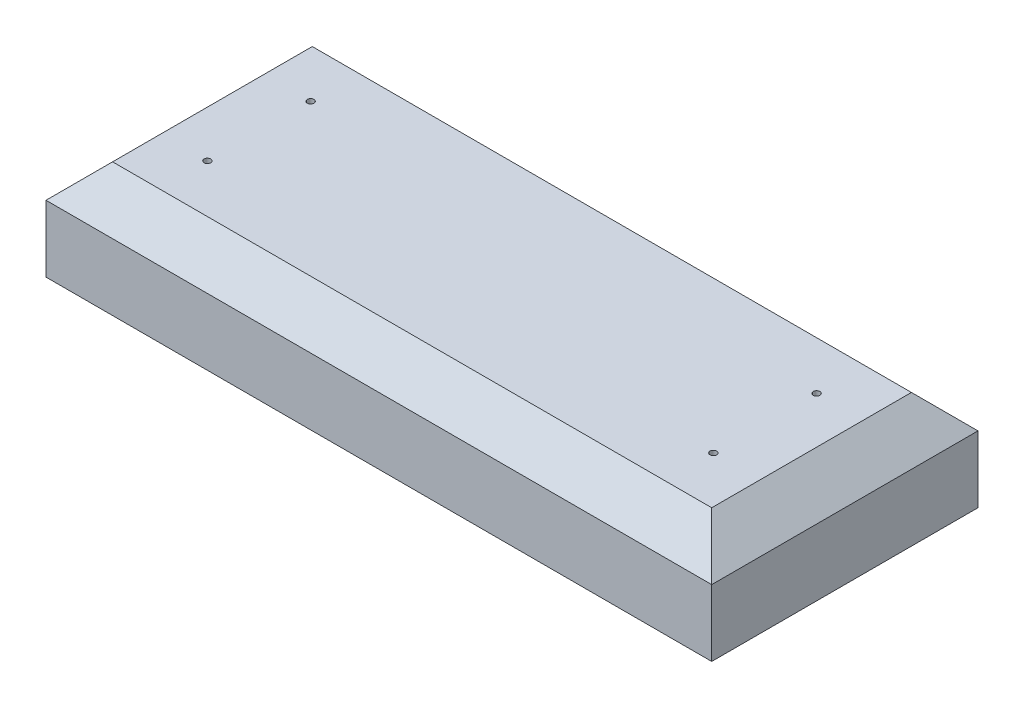
ISO-10303-21;
HEADER;
FILE_DESCRIPTION(('STEP AP214'),'2;1');
FILE_NAME('part.step','',(''),(''),'','','');
FILE_SCHEMA(('AUTOMOTIVE_DESIGN { 1 0 10303 214 1 1 1 1 }'));
ENDSEC;
DATA;
#1=APPLICATION_CONTEXT('core data for automotive mechanical design processes');
#2=APPLICATION_PROTOCOL_DEFINITION('international standard','automotive_design',2000,#1);
#3=PRODUCT_CONTEXT('',#1,'mechanical');
#4=PRODUCT('Part','Part','',(#3));
#5=PRODUCT_RELATED_PRODUCT_CATEGORY('part','',(#4));
#6=PRODUCT_DEFINITION_FORMATION('','',#4);
#7=PRODUCT_DEFINITION_CONTEXT('part definition',#1,'design');
#8=PRODUCT_DEFINITION('design','',#6,#7);
#9=PRODUCT_DEFINITION_SHAPE('','',#8);
#10=(LENGTH_UNIT() NAMED_UNIT(*) SI_UNIT(.MILLI.,.METRE.));
#11=(NAMED_UNIT(*) PLANE_ANGLE_UNIT() SI_UNIT($,.RADIAN.));
#12=(NAMED_UNIT(*) SI_UNIT($,.STERADIAN.) SOLID_ANGLE_UNIT());
#13=UNCERTAINTY_MEASURE_WITH_UNIT(LENGTH_MEASURE(1.E-05),#10,'distance_accuracy_value','');
#14=(GEOMETRIC_REPRESENTATION_CONTEXT(3) GLOBAL_UNCERTAINTY_ASSIGNED_CONTEXT((#13)) GLOBAL_UNIT_ASSIGNED_CONTEXT((#10,
#11,#12)) REPRESENTATION_CONTEXT('',''));
#15=CARTESIAN_POINT('',(0.,0.,0.));
#16=DIRECTION('',(0.,0.,1.));
#17=DIRECTION('',(1.,0.,0.));
#18=AXIS2_PLACEMENT_3D('',#15,#16,#17);
#19=CARTESIAN_POINT('',(-150.550128534704,-10.,-12.2892030848329));
#20=DIRECTION('',(0.,1.,0.));
#21=DIRECTION('',(0.,0.,1.));
#22=AXIS2_PLACEMENT_3D('',#19,#20,#21);
#23=CYLINDRICAL_SURFACE('',#22,1.);
#24=CARTESIAN_POINT('',(-150.550128534704,30.,-12.2892030848329));
#25=DIRECTION('',(0.,1.,0.));
#26=DIRECTION('',(0.,0.,1.));
#27=AXIS2_PLACEMENT_3D('',#24,#25,#26);
#28=CIRCLE('',#27,1.);
#29=CARTESIAN_POINT('',(-150.550128534704,30.,-11.2892030848329));
#30=VERTEX_POINT('',#29);
#31=EDGE_CURVE('E55',#30,#30,#28,.T.);
#32=ORIENTED_EDGE('',*,*,#31,.T.);
#33=EDGE_LOOP('',(#32));
#34=FACE_BOUND('',#33,.T.);
#35=CARTESIAN_POINT('',(-150.550128534704,0.,-12.2892030848329));
#36=DIRECTION('',(0.,1.,0.));
#37=DIRECTION('',(0.,0.,1.));
#38=AXIS2_PLACEMENT_3D('',#35,#36,#37);
#39=CIRCLE('',#38,1.);
#40=CARTESIAN_POINT('',(-150.550128534704,0.,-11.2892030848329));
#41=VERTEX_POINT('',#40);
#42=EDGE_CURVE('E11',#41,#41,#39,.T.);
#43=ORIENTED_EDGE('',*,*,#42,.F.);
#44=EDGE_LOOP('',(#43));
#45=FACE_BOUND('',#44,.T.);
#46=ADVANCED_FACE('F47',(#34,#45),#23,.F.);
#47=CARTESIAN_POINT('',(1.4498714652956,-10.,-12.2892030848329));
#48=DIRECTION('',(0.,1.,0.));
#49=DIRECTION('',(0.,0.,1.));
#50=AXIS2_PLACEMENT_3D('',#47,#48,#49);
#51=CYLINDRICAL_SURFACE('',#50,1.);
#52=CARTESIAN_POINT('',(1.4498714652956,30.,-12.2892030848329));
#53=DIRECTION('',(0.,1.,0.));
#54=DIRECTION('',(0.,0.,1.));
#55=AXIS2_PLACEMENT_3D('',#52,#53,#54);
#56=CIRCLE('',#55,1.);
#57=CARTESIAN_POINT('',(1.4498714652956,30.,-11.2892030848329));
#58=VERTEX_POINT('',#57);
#59=EDGE_CURVE('E168',#58,#58,#56,.T.);
#60=ORIENTED_EDGE('',*,*,#59,.T.);
#61=EDGE_LOOP('',(#60));
#62=FACE_BOUND('',#61,.T.);
#63=CARTESIAN_POINT('',(1.4498714652956,0.,-12.2892030848329));
#64=DIRECTION('',(0.,1.,0.));
#65=DIRECTION('',(0.,0.,1.));
#66=AXIS2_PLACEMENT_3D('',#63,#64,#65);
#67=CIRCLE('',#66,1.);
#68=CARTESIAN_POINT('',(1.4498714652956,0.,-11.2892030848329));
#69=VERTEX_POINT('',#68);
#70=EDGE_CURVE('E185',#69,#69,#67,.T.);
#71=ORIENTED_EDGE('',*,*,#70,.F.);
#72=EDGE_LOOP('',(#71));
#73=FACE_BOUND('',#72,.T.);
#74=ADVANCED_FACE('F213',(#62,#73),#51,.F.);
#75=CARTESIAN_POINT('',(25.4498714652956,30.,-67.7892030848329));
#76=DIRECTION('',(-1.,0.,0.));
#77=DIRECTION('',(0.,0.,1.));
#78=AXIS2_PLACEMENT_3D('',#75,#76,#77);
#79=PLANE('',#78);
#80=DIRECTION('',(0.,-1.,0.));
#81=VECTOR('',#80,1.);
#82=CARTESIAN_POINT('',(25.4498714652956,30.,-67.7892030848329));
#83=LINE('',#82,#81);
#84=CARTESIAN_POINT('',(25.4498714652956,20.,-67.7892030848329));
#85=VERTEX_POINT('',#84);
#86=CARTESIAN_POINT('',(25.4498714652956,0.,-67.7892030848329));
#87=VERTEX_POINT('',#86);
#88=EDGE_CURVE('E99',#85,#87,#83,.T.);
#89=ORIENTED_EDGE('',*,*,#88,.F.);
#90=DIRECTION('',(0.,0.,1.));
#91=VECTOR('',#90,1.);
#92=CARTESIAN_POINT('',(25.4498714652956,20.,12.2107969151671));
#93=LINE('',#92,#91);
#94=CARTESIAN_POINT('',(25.4498714652956,20.,12.2107969151671));
#95=VERTEX_POINT('',#94);
#96=EDGE_CURVE('E62',#85,#95,#93,.T.);
#97=ORIENTED_EDGE('',*,*,#96,.T.);
#98=DIRECTION('',(0.,-1.,0.));
#99=VECTOR('',#98,1.);
#100=CARTESIAN_POINT('',(25.4498714652956,30.,12.2107969151671));
#101=LINE('',#100,#99);
#102=CARTESIAN_POINT('',(25.4498714652956,0.,12.2107969151671));
#103=VERTEX_POINT('',#102);
#104=EDGE_CURVE('E120',#95,#103,#101,.T.);
#105=ORIENTED_EDGE('',*,*,#104,.T.);
#106=DIRECTION('',(0.,0.,-1.));
#107=VECTOR('',#106,1.);
#108=CARTESIAN_POINT('',(25.4498714652956,0.,-67.7892030848329));
#109=LINE('',#108,#107);
#110=EDGE_CURVE('E114',#103,#87,#109,.T.);
#111=ORIENTED_EDGE('',*,*,#110,.T.);
#112=EDGE_LOOP('',(#89,#97,#105,#111));
#113=FACE_BOUND('',#112,.T.);
#114=ADVANCED_FACE('F119',(#113),#79,.F.);
#115=CARTESIAN_POINT('',(-174.550128534704,30.,-67.7892030848329));
#116=DIRECTION('',(0.,0.,1.));
#117=DIRECTION('',(1.,0.,0.));
#118=AXIS2_PLACEMENT_3D('',#115,#116,#117);
#119=PLANE('',#118);
#120=DIRECTION('',(0.,-1.,0.));
#121=VECTOR('',#120,1.);
#122=CARTESIAN_POINT('',(-174.550128534704,30.,-67.7892030848329));
#123=LINE('',#122,#121);
#124=CARTESIAN_POINT('',(-174.550128534704,20.,-67.7892030848329));
#125=VERTEX_POINT('',#124);
#126=CARTESIAN_POINT('',(-174.550128534704,0.,-67.7892030848329));
#127=VERTEX_POINT('',#126);
#128=EDGE_CURVE('E107',#125,#127,#123,.T.);
#129=ORIENTED_EDGE('',*,*,#128,.F.);
#130=DIRECTION('',(1.,0.,0.));
#131=VECTOR('',#130,1.);
#132=CARTESIAN_POINT('',(25.4498714652956,20.,-67.7892030848329));
#133=LINE('',#132,#131);
#134=EDGE_CURVE('E70',#125,#85,#133,.T.);
#135=ORIENTED_EDGE('',*,*,#134,.T.);
#136=ORIENTED_EDGE('',*,*,#88,.T.);
#137=DIRECTION('',(-1.,0.,0.));
#138=VECTOR('',#137,1.);
#139=CARTESIAN_POINT('',(-174.550128534704,0.,-67.7892030848329));
#140=LINE('',#139,#138);
#141=EDGE_CURVE('E102',#87,#127,#140,.T.);
#142=ORIENTED_EDGE('',*,*,#141,.T.);
#143=EDGE_LOOP('',(#129,#135,#136,#142));
#144=FACE_BOUND('',#143,.T.);
#145=ADVANCED_FACE('F101',(#144),#119,.F.);
#146=CARTESIAN_POINT('',(-174.550128534704,30.,-67.7892030848329));
#147=DIRECTION('',(1.,0.,0.));
#148=DIRECTION('',(0.,0.,-1.));
#149=AXIS2_PLACEMENT_3D('',#146,#147,#148);
#150=PLANE('',#149);
#151=DIRECTION('',(0.,-1.,0.));
#152=VECTOR('',#151,1.);
#153=CARTESIAN_POINT('',(-174.550128534704,30.,12.2107969151671));
#154=LINE('',#153,#152);
#155=CARTESIAN_POINT('',(-174.550128534704,20.,12.2107969151671));
#156=VERTEX_POINT('',#155);
#157=CARTESIAN_POINT('',(-174.550128534704,0.,12.2107969151671));
#158=VERTEX_POINT('',#157);
#159=EDGE_CURVE('E140',#156,#158,#154,.T.);
#160=ORIENTED_EDGE('',*,*,#159,.F.);
#161=DIRECTION('',(0.,0.,-1.));
#162=VECTOR('',#161,1.);
#163=CARTESIAN_POINT('',(-174.550128534704,20.,-67.7892030848329));
#164=LINE('',#163,#162);
#165=EDGE_CURVE('E157',#156,#125,#164,.T.);
#166=ORIENTED_EDGE('',*,*,#165,.T.);
#167=ORIENTED_EDGE('',*,*,#128,.T.);
#168=DIRECTION('',(0.,0.,1.));
#169=VECTOR('',#168,1.);
#170=CARTESIAN_POINT('',(-174.550128534704,0.,-67.7892030848329));
#171=LINE('',#170,#169);
#172=EDGE_CURVE('E116',#127,#158,#171,.T.);
#173=ORIENTED_EDGE('',*,*,#172,.T.);
#174=EDGE_LOOP('',(#160,#166,#167,#173));
#175=FACE_BOUND('',#174,.T.);
#176=ADVANCED_FACE('F206',(#175),#150,.F.);
#177=CARTESIAN_POINT('',(-174.550128534704,30.,12.2107969151671));
#178=DIRECTION('',(0.,0.,-1.));
#179=DIRECTION('',(-1.,0.,0.));
#180=AXIS2_PLACEMENT_3D('',#177,#178,#179);
#181=PLANE('',#180);
#182=ORIENTED_EDGE('',*,*,#104,.F.);
#183=DIRECTION('',(-1.,0.,0.));
#184=VECTOR('',#183,1.);
#185=CARTESIAN_POINT('',(-174.550128534704,20.,12.2107969151671));
#186=LINE('',#185,#184);
#187=EDGE_CURVE('E165',#95,#156,#186,.T.);
#188=ORIENTED_EDGE('',*,*,#187,.T.);
#189=ORIENTED_EDGE('',*,*,#159,.T.);
#190=DIRECTION('',(1.,0.,0.));
#191=VECTOR('',#190,1.);
#192=CARTESIAN_POINT('',(-174.550128534704,0.,12.2107969151671));
#193=LINE('',#192,#191);
#194=EDGE_CURVE('E135',#158,#103,#193,.T.);
#195=ORIENTED_EDGE('',*,*,#194,.T.);
#196=EDGE_LOOP('',(#182,#188,#189,#195));
#197=FACE_BOUND('',#196,.T.);
#198=ADVANCED_FACE('F196',(#197),#181,.F.);
#199=CARTESIAN_POINT('',(0.,30.,0.));
#200=DIRECTION('',(0.,1.,0.));
#201=DIRECTION('',(0.,0.,1.));
#202=AXIS2_PLACEMENT_3D('',#199,#200,#201);
#203=PLANE('',#202);
#204=CARTESIAN_POINT('',(-150.550128534704,30.,-43.2892030848329));
#205=DIRECTION('',(0.,1.,0.));
#206=DIRECTION('',(0.,0.,1.));
#207=AXIS2_PLACEMENT_3D('',#204,#205,#206);
#208=CIRCLE('',#207,1.);
#209=CARTESIAN_POINT('',(-150.550128534704,30.,-42.2892030848329));
#210=VERTEX_POINT('',#209);
#211=EDGE_CURVE('E384',#210,#210,#208,.T.);
#212=ORIENTED_EDGE('',*,*,#211,.F.);
#213=EDGE_LOOP('',(#212));
#214=FACE_BOUND('',#213,.T.);
#215=CARTESIAN_POINT('',(1.44987146529561,30.,-43.2892030848329));
#216=DIRECTION('',(0.,1.,0.));
#217=DIRECTION('',(0.,0.,1.));
#218=AXIS2_PLACEMENT_3D('',#215,#216,#217);
#219=CIRCLE('',#218,1.);
#220=CARTESIAN_POINT('',(1.44987146529561,30.,-42.2892030848329));
#221=VERTEX_POINT('',#220);
#222=EDGE_CURVE('E130',#221,#221,#219,.T.);
#223=ORIENTED_EDGE('',*,*,#222,.F.);
#224=EDGE_LOOP('',(#223));
#225=FACE_BOUND('',#224,.T.);
#226=DIRECTION('',(-1.,0.,0.));
#227=VECTOR('',#226,1.);
#228=CARTESIAN_POINT('',(-174.550128534704,30.,-57.7892030848329));
#229=LINE('',#228,#227);
#230=CARTESIAN_POINT('',(15.4498714652956,30.,-57.7892030848329));
#231=VERTEX_POINT('',#230);
#232=CARTESIAN_POINT('',(-164.550128534704,30.,-57.7892030848329));
#233=VERTEX_POINT('',#232);
#234=EDGE_CURVE('E150',#231,#233,#229,.T.);
#235=ORIENTED_EDGE('',*,*,#234,.T.);
#236=DIRECTION('',(0.,0.,1.));
#237=VECTOR('',#236,1.);
#238=CARTESIAN_POINT('',(-164.550128534704,30.,12.2107969151671));
#239=LINE('',#238,#237);
#240=CARTESIAN_POINT('',(-164.550128534704,30.,2.21079691516707));
#241=VERTEX_POINT('',#240);
#242=EDGE_CURVE('E153',#233,#241,#239,.T.);
#243=ORIENTED_EDGE('',*,*,#242,.T.);
#244=DIRECTION('',(1.,0.,0.));
#245=VECTOR('',#244,1.);
#246=CARTESIAN_POINT('',(25.4498714652956,30.,2.21079691516707));
#247=LINE('',#246,#245);
#248=CARTESIAN_POINT('',(15.4498714652956,30.,2.21079691516707));
#249=VERTEX_POINT('',#248);
#250=EDGE_CURVE('E106',#241,#249,#247,.T.);
#251=ORIENTED_EDGE('',*,*,#250,.T.);
#252=DIRECTION('',(0.,0.,-1.));
#253=VECTOR('',#252,1.);
#254=CARTESIAN_POINT('',(15.4498714652956,30.,-67.7892030848329));
#255=LINE('',#254,#253);
#256=EDGE_CURVE('E147',#249,#231,#255,.T.);
#257=ORIENTED_EDGE('',*,*,#256,.T.);
#258=EDGE_LOOP('',(#235,#243,#251,#257));
#259=FACE_BOUND('',#258,.T.);
#260=ORIENTED_EDGE('',*,*,#59,.F.);
#261=EDGE_LOOP('',(#260));
#262=FACE_BOUND('',#261,.T.);
#263=ORIENTED_EDGE('',*,*,#31,.F.);
#264=EDGE_LOOP('',(#263));
#265=FACE_BOUND('',#264,.T.);
#266=ADVANCED_FACE('F194',(#214,#225,#259,#262,#265),#203,.T.);
#267=CARTESIAN_POINT('',(0.,0.,0.));
#268=DIRECTION('',(0.,1.,0.));
#269=DIRECTION('',(0.,0.,1.));
#270=AXIS2_PLACEMENT_3D('',#267,#268,#269);
#271=PLANE('',#270);
#272=CARTESIAN_POINT('',(-150.550128534704,0.,-43.2892030848329));
#273=DIRECTION('',(0.,1.,0.));
#274=DIRECTION('',(0.,0.,1.));
#275=AXIS2_PLACEMENT_3D('',#272,#273,#274);
#276=CIRCLE('',#275,1.);
#277=CARTESIAN_POINT('',(-150.550128534704,0.,-42.2892030848329));
#278=VERTEX_POINT('',#277);
#279=EDGE_CURVE('E387',#278,#278,#276,.T.);
#280=ORIENTED_EDGE('',*,*,#279,.T.);
#281=EDGE_LOOP('',(#280));
#282=FACE_BOUND('',#281,.T.);
#283=CARTESIAN_POINT('',(1.44987146529561,0.,-43.2892030848329));
#284=DIRECTION('',(0.,1.,0.));
#285=DIRECTION('',(0.,0.,1.));
#286=AXIS2_PLACEMENT_3D('',#283,#284,#285);
#287=CIRCLE('',#286,1.);
#288=CARTESIAN_POINT('',(1.44987146529561,0.,-42.2892030848329));
#289=VERTEX_POINT('',#288);
#290=EDGE_CURVE('E173',#289,#289,#287,.T.);
#291=ORIENTED_EDGE('',*,*,#290,.T.);
#292=EDGE_LOOP('',(#291));
#293=FACE_BOUND('',#292,.T.);
#294=ORIENTED_EDGE('',*,*,#110,.F.);
#295=ORIENTED_EDGE('',*,*,#194,.F.);
#296=ORIENTED_EDGE('',*,*,#172,.F.);
#297=ORIENTED_EDGE('',*,*,#141,.F.);
#298=EDGE_LOOP('',(#294,#295,#296,#297));
#299=FACE_BOUND('',#298,.T.);
#300=ORIENTED_EDGE('',*,*,#70,.T.);
#301=EDGE_LOOP('',(#300));
#302=FACE_BOUND('',#301,.T.);
#303=ORIENTED_EDGE('',*,*,#42,.T.);
#304=EDGE_LOOP('',(#303));
#305=FACE_BOUND('',#304,.T.);
#306=ADVANCED_FACE('F111',(#282,#293,#299,#302,#305),#271,.F.);
#307=CARTESIAN_POINT('',(15.4498714652956,30.,0.));
#308=DIRECTION('',(0.707106781186549,0.707106781186547,0.));
#309=DIRECTION('',(0.,0.,1.));
#310=AXIS2_PLACEMENT_3D('',#307,#308,#309);
#311=PLANE('',#310);
#312=DIRECTION('',(-0.577350269189625,0.577350269189627,-0.577350269189625));
#313=VECTOR('',#312,1.);
#314=CARTESIAN_POINT('',(10.2999143101971,35.1499571550985,-2.93916023993146));
#315=LINE('',#314,#313);
#316=EDGE_CURVE('E127',#95,#249,#315,.T.);
#317=ORIENTED_EDGE('',*,*,#316,.F.);
#318=ORIENTED_EDGE('',*,*,#96,.F.);
#319=DIRECTION('',(-0.577350269189625,0.577350269189627,0.577350269189625));
#320=VECTOR('',#319,1.);
#321=CARTESIAN_POINT('',(-3.81319622964867,49.2630676949443,-38.5261353898887));
#322=LINE('',#321,#320);
#323=EDGE_CURVE('E123',#231,#85,#322,.F.);
#324=ORIENTED_EDGE('',*,*,#323,.F.);
#325=ORIENTED_EDGE('',*,*,#256,.F.);
#326=EDGE_LOOP('',(#317,#318,#324,#325));
#327=FACE_BOUND('',#326,.T.);
#328=ADVANCED_FACE('F203',(#327),#311,.T.);
#329=CARTESIAN_POINT('',(0.,30.,-57.7892030848329));
#330=DIRECTION('',(0.,0.707106781186547,-0.707106781186549));
#331=DIRECTION('',(1.,0.,0.));
#332=AXIS2_PLACEMENT_3D('',#329,#330,#331);
#333=PLANE('',#332);
#334=ORIENTED_EDGE('',*,*,#323,.T.);
#335=ORIENTED_EDGE('',*,*,#134,.F.);
#336=DIRECTION('',(0.577350269189625,0.577350269189627,0.577350269189625));
#337=VECTOR('',#336,1.);
#338=CARTESIAN_POINT('',(-109.700085689803,84.8500428449015,-2.93916023993156));
#339=LINE('',#338,#337);
#340=EDGE_CURVE('E172',#233,#125,#339,.F.);
#341=ORIENTED_EDGE('',*,*,#340,.F.);
#342=ORIENTED_EDGE('',*,*,#234,.F.);
#343=EDGE_LOOP('',(#334,#335,#341,#342));
#344=FACE_BOUND('',#343,.T.);
#345=ADVANCED_FACE('F230',(#344),#333,.T.);
#346=CARTESIAN_POINT('',(0.,30.,2.21079691516707));
#347=DIRECTION('',(0.,0.707106781186547,0.707106781186549));
#348=DIRECTION('',(-1.,0.,0.));
#349=AXIS2_PLACEMENT_3D('',#346,#347,#348);
#350=PLANE('',#349);
#351=ORIENTED_EDGE('',*,*,#316,.T.);
#352=ORIENTED_EDGE('',*,*,#250,.F.);
#353=DIRECTION('',(-0.577350269189625,-0.577350269189627,0.577350269189625));
#354=VECTOR('',#353,1.);
#355=CARTESIAN_POINT('',(-109.700085689803,84.8500428449015,-52.6392459297343));
#356=LINE('',#355,#354);
#357=EDGE_CURVE('E169',#156,#241,#356,.F.);
#358=ORIENTED_EDGE('',*,*,#357,.F.);
#359=ORIENTED_EDGE('',*,*,#187,.F.);
#360=EDGE_LOOP('',(#351,#352,#358,#359));
#361=FACE_BOUND('',#360,.T.);
#362=ADVANCED_FACE('F237',(#361),#350,.T.);
#363=CARTESIAN_POINT('',(-164.550128534704,30.,0.));
#364=DIRECTION('',(-0.707106781186549,0.707106781186547,0.));
#365=DIRECTION('',(0.,0.,-1.));
#366=AXIS2_PLACEMENT_3D('',#363,#364,#365);
#367=PLANE('',#366);
#368=ORIENTED_EDGE('',*,*,#340,.T.);
#369=ORIENTED_EDGE('',*,*,#165,.F.);
#370=ORIENTED_EDGE('',*,*,#357,.T.);
#371=ORIENTED_EDGE('',*,*,#242,.F.);
#372=EDGE_LOOP('',(#368,#369,#370,#371));
#373=FACE_BOUND('',#372,.T.);
#374=ADVANCED_FACE('F244',(#373),#367,.T.);
#375=CARTESIAN_POINT('',(1.44987146529561,-10.,-43.2892030848329));
#376=DIRECTION('',(0.,1.,0.));
#377=DIRECTION('',(0.,0.,1.));
#378=AXIS2_PLACEMENT_3D('',#375,#376,#377);
#379=CYLINDRICAL_SURFACE('',#378,1.);
#380=ORIENTED_EDGE('',*,*,#222,.T.);
#381=EDGE_LOOP('',(#380));
#382=FACE_BOUND('',#381,.T.);
#383=ORIENTED_EDGE('',*,*,#290,.F.);
#384=EDGE_LOOP('',(#383));
#385=FACE_BOUND('',#384,.T.);
#386=ADVANCED_FACE('F249',(#382,#385),#379,.F.);
#387=CARTESIAN_POINT('',(-150.550128534704,-10.,-43.2892030848329));
#388=DIRECTION('',(0.,1.,0.));
#389=DIRECTION('',(0.,0.,1.));
#390=AXIS2_PLACEMENT_3D('',#387,#388,#389);
#391=CYLINDRICAL_SURFACE('',#390,1.);
#392=ORIENTED_EDGE('',*,*,#211,.T.);
#393=EDGE_LOOP('',(#392));
#394=FACE_BOUND('',#393,.T.);
#395=ORIENTED_EDGE('',*,*,#279,.F.);
#396=EDGE_LOOP('',(#395));
#397=FACE_BOUND('',#396,.T.);
#398=ADVANCED_FACE('F317',(#394,#397),#391,.F.);
#399=CLOSED_SHELL('',(#46,#74,#114,#145,#176,#198,#266,#306,#328,#345,#362,#374,#386,#398));
#400=MANIFOLD_SOLID_BREP('B2',#399);
#401=ADVANCED_BREP_SHAPE_REPRESENTATION('',(#18,#400),#14);
#402=SHAPE_DEFINITION_REPRESENTATION(#9,#401);
ENDSEC;
END-ISO-10303-21;
